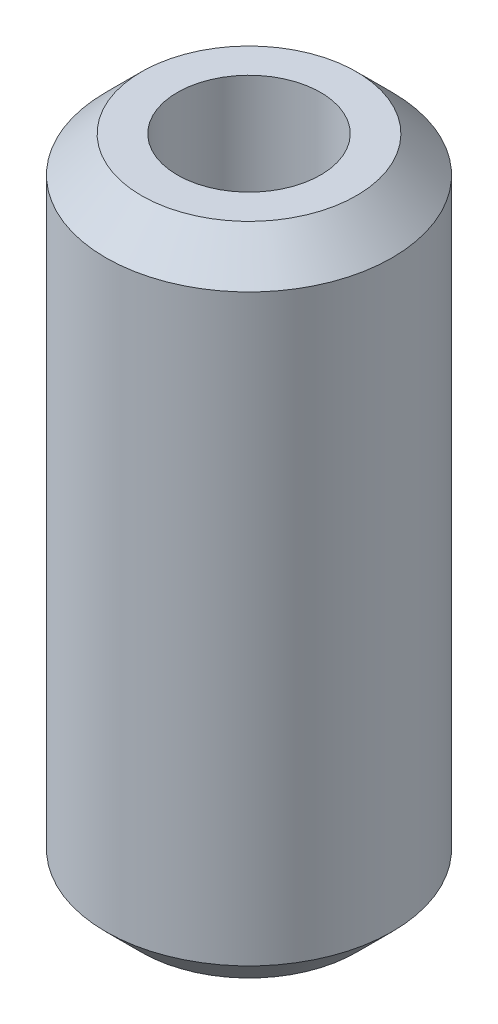
ISO-10303-21;
HEADER;
FILE_DESCRIPTION(('STEP AP214'),'2;1');
FILE_NAME('part.step','',(''),(''),'','','');
FILE_SCHEMA(('AUTOMOTIVE_DESIGN { 1 0 10303 214 1 1 1 1 }'));
ENDSEC;
DATA;
#1=APPLICATION_CONTEXT('core data for automotive mechanical design processes');
#2=APPLICATION_PROTOCOL_DEFINITION('international standard','automotive_design',2000,#1);
#3=PRODUCT_CONTEXT('',#1,'mechanical');
#4=PRODUCT('Part','Part','',(#3));
#5=PRODUCT_RELATED_PRODUCT_CATEGORY('part','',(#4));
#6=PRODUCT_DEFINITION_FORMATION('','',#4);
#7=PRODUCT_DEFINITION_CONTEXT('part definition',#1,'design');
#8=PRODUCT_DEFINITION('design','',#6,#7);
#9=PRODUCT_DEFINITION_SHAPE('','',#8);
#10=(LENGTH_UNIT() NAMED_UNIT(*) SI_UNIT(.MILLI.,.METRE.));
#11=(NAMED_UNIT(*) PLANE_ANGLE_UNIT() SI_UNIT($,.RADIAN.));
#12=(NAMED_UNIT(*) SI_UNIT($,.STERADIAN.) SOLID_ANGLE_UNIT());
#13=UNCERTAINTY_MEASURE_WITH_UNIT(LENGTH_MEASURE(1.E-05),#10,'distance_accuracy_value','');
#14=(GEOMETRIC_REPRESENTATION_CONTEXT(3) GLOBAL_UNCERTAINTY_ASSIGNED_CONTEXT((#13)) GLOBAL_UNIT_ASSIGNED_CONTEXT((#10,
#11,#12)) REPRESENTATION_CONTEXT('',''));
#15=CARTESIAN_POINT('',(0.,0.,0.));
#16=DIRECTION('',(0.,0.,1.));
#17=DIRECTION('',(1.,0.,0.));
#18=AXIS2_PLACEMENT_3D('',#15,#16,#17);
#19=CARTESIAN_POINT('',(0.,18.3,0.));
#20=DIRECTION('',(0.,1.,0.));
#21=DIRECTION('',(0.,0.,1.));
#22=AXIS2_PLACEMENT_3D('',#19,#20,#21);
#23=PLANE('',#22);
#24=CARTESIAN_POINT('',(0.,18.3,0.));
#25=DIRECTION('',(0.,1.,0.));
#26=DIRECTION('',(0.,0.,1.));
#27=AXIS2_PLACEMENT_3D('',#24,#25,#26);
#28=CIRCLE('',#27,3.);
#29=CARTESIAN_POINT('',(0.,18.3,3.));
#30=VERTEX_POINT('',#29);
#31=EDGE_CURVE('E10',#30,#30,#28,.T.);
#32=ORIENTED_EDGE('',*,*,#31,.T.);
#33=EDGE_LOOP('',(#32));
#34=FACE_BOUND('',#33,.T.);
#35=CARTESIAN_POINT('',(0.,18.3,0.));
#36=DIRECTION('',(0.,1.,0.));
#37=DIRECTION('',(0.,0.,1.));
#38=AXIS2_PLACEMENT_3D('',#35,#36,#37);
#39=CIRCLE('',#38,2.);
#40=CARTESIAN_POINT('',(0.,18.3,2.));
#41=VERTEX_POINT('',#40);
#42=EDGE_CURVE('E53',#41,#41,#39,.T.);
#43=ORIENTED_EDGE('',*,*,#42,.F.);
#44=EDGE_LOOP('',(#43));
#45=FACE_BOUND('',#44,.T.);
#46=ADVANCED_FACE('F33',(#34,#45),#23,.T.);
#47=CARTESIAN_POINT('',(0.,0.,0.));
#48=DIRECTION('',(0.,1.,0.));
#49=DIRECTION('',(0.,0.,1.));
#50=AXIS2_PLACEMENT_3D('',#47,#48,#49);
#51=PLANE('',#50);
#52=CARTESIAN_POINT('',(0.,0.,0.));
#53=DIRECTION('',(0.,1.,0.));
#54=DIRECTION('',(0.,0.,1.));
#55=AXIS2_PLACEMENT_3D('',#52,#53,#54);
#56=CIRCLE('',#55,3.);
#57=CARTESIAN_POINT('',(0.,0.,3.));
#58=VERTEX_POINT('',#57);
#59=EDGE_CURVE('E40',#58,#58,#56,.F.);
#60=ORIENTED_EDGE('',*,*,#59,.T.);
#61=EDGE_LOOP('',(#60));
#62=FACE_BOUND('',#61,.T.);
#63=CARTESIAN_POINT('',(0.,0.,0.));
#64=DIRECTION('',(0.,1.,0.));
#65=DIRECTION('',(0.,0.,1.));
#66=AXIS2_PLACEMENT_3D('',#63,#64,#65);
#67=CIRCLE('',#66,2.);
#68=CARTESIAN_POINT('',(0.,0.,2.));
#69=VERTEX_POINT('',#68);
#70=EDGE_CURVE('E54',#69,#69,#67,.T.);
#71=ORIENTED_EDGE('',*,*,#70,.T.);
#72=EDGE_LOOP('',(#71));
#73=FACE_BOUND('',#72,.T.);
#74=ADVANCED_FACE('F64',(#62,#73),#51,.F.);
#75=CARTESIAN_POINT('',(0.,18.3,0.));
#76=DIRECTION('',(0.,-1.,0.));
#77=DIRECTION('',(0.,0.,-1.));
#78=AXIS2_PLACEMENT_3D('',#75,#76,#77);
#79=CYLINDRICAL_SURFACE('',#78,4.);
#80=CARTESIAN_POINT('',(0.,0.999999999999997,0.));
#81=DIRECTION('',(0.,1.,0.));
#82=DIRECTION('',(0.,0.,1.));
#83=AXIS2_PLACEMENT_3D('',#80,#81,#82);
#84=CIRCLE('',#83,4.);
#85=CARTESIAN_POINT('',(0.,0.999999999999997,4.));
#86=VERTEX_POINT('',#85);
#87=EDGE_CURVE('E44',#86,#86,#84,.T.);
#88=ORIENTED_EDGE('',*,*,#87,.T.);
#89=EDGE_LOOP('',(#88));
#90=FACE_BOUND('',#89,.T.);
#91=CARTESIAN_POINT('',(0.,17.3,0.));
#92=DIRECTION('',(0.,1.,0.));
#93=DIRECTION('',(0.,0.,1.));
#94=AXIS2_PLACEMENT_3D('',#91,#92,#93);
#95=CIRCLE('',#94,4.);
#96=CARTESIAN_POINT('',(0.,17.3,4.));
#97=VERTEX_POINT('',#96);
#98=EDGE_CURVE('E48',#97,#97,#95,.F.);
#99=ORIENTED_EDGE('',*,*,#98,.T.);
#100=EDGE_LOOP('',(#99));
#101=FACE_BOUND('',#100,.T.);
#102=ADVANCED_FACE('F69',(#90,#101),#79,.T.);
#103=CARTESIAN_POINT('',(0.,18.3,0.));
#104=DIRECTION('',(0.,-1.,0.));
#105=DIRECTION('',(0.,0.,-1.));
#106=AXIS2_PLACEMENT_3D('',#103,#104,#105);
#107=CYLINDRICAL_SURFACE('',#106,2.);
#108=ORIENTED_EDGE('',*,*,#42,.T.);
#109=EDGE_LOOP('',(#108));
#110=FACE_BOUND('',#109,.T.);
#111=ORIENTED_EDGE('',*,*,#70,.F.);
#112=EDGE_LOOP('',(#111));
#113=FACE_BOUND('',#112,.T.);
#114=ADVANCED_FACE('F60',(#110,#113),#107,.F.);
#115=CARTESIAN_POINT('',(0.,0.999999999999997,0.));
#116=DIRECTION('',(0.,1.,0.));
#117=DIRECTION('',(0.,0.,1.));
#118=AXIS2_PLACEMENT_3D('',#115,#116,#117);
#119=CONICAL_SURFACE('',#118,4.,0.785398163397451);
#120=ORIENTED_EDGE('',*,*,#59,.F.);
#121=EDGE_LOOP('',(#120));
#122=FACE_BOUND('',#121,.T.);
#123=ORIENTED_EDGE('',*,*,#87,.F.);
#124=EDGE_LOOP('',(#123));
#125=FACE_BOUND('',#124,.T.);
#126=ADVANCED_FACE('F75',(#122,#125),#119,.T.);
#127=CARTESIAN_POINT('',(0.,18.3,0.));
#128=DIRECTION('',(0.,-1.,0.));
#129=DIRECTION('',(0.,0.,-1.));
#130=AXIS2_PLACEMENT_3D('',#127,#128,#129);
#131=CONICAL_SURFACE('',#130,3.,0.785398163397447);
#132=ORIENTED_EDGE('',*,*,#98,.F.);
#133=EDGE_LOOP('',(#132));
#134=FACE_BOUND('',#133,.T.);
#135=ORIENTED_EDGE('',*,*,#31,.F.);
#136=EDGE_LOOP('',(#135));
#137=FACE_BOUND('',#136,.T.);
#138=ADVANCED_FACE('F35',(#134,#137),#131,.T.);
#139=CLOSED_SHELL('',(#46,#74,#102,#114,#126,#138));
#140=MANIFOLD_SOLID_BREP('B2',#139);
#141=ADVANCED_BREP_SHAPE_REPRESENTATION('',(#18,#140),#14);
#142=SHAPE_DEFINITION_REPRESENTATION(#9,#141);
ENDSEC;
END-ISO-10303-21;
